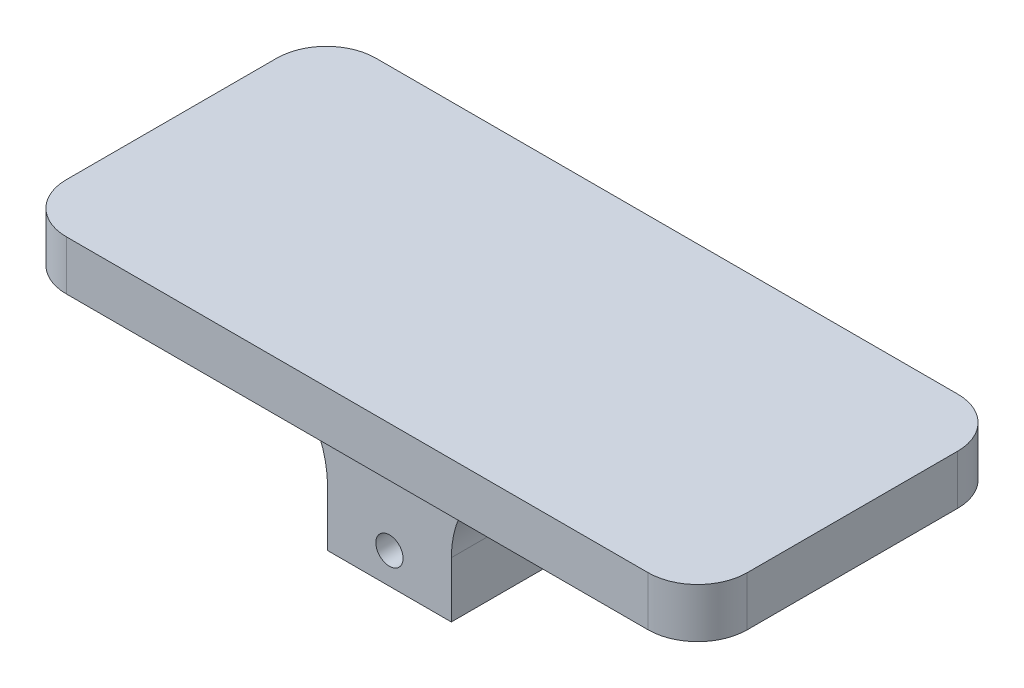
ISO-10303-21;
HEADER;
FILE_DESCRIPTION(('STEP AP214'),'2;1');
FILE_NAME('part.step','',(''),(''),'','','');
FILE_SCHEMA(('AUTOMOTIVE_DESIGN { 1 0 10303 214 1 1 1 1 }'));
ENDSEC;
DATA;
#1=APPLICATION_CONTEXT('core data for automotive mechanical design processes');
#2=APPLICATION_PROTOCOL_DEFINITION('international standard','automotive_design',2000,#1);
#3=PRODUCT_CONTEXT('',#1,'mechanical');
#4=PRODUCT('Part','Part','',(#3));
#5=PRODUCT_RELATED_PRODUCT_CATEGORY('part','',(#4));
#6=PRODUCT_DEFINITION_FORMATION('','',#4);
#7=PRODUCT_DEFINITION_CONTEXT('part definition',#1,'design');
#8=PRODUCT_DEFINITION('design','',#6,#7);
#9=PRODUCT_DEFINITION_SHAPE('','',#8);
#10=(LENGTH_UNIT() NAMED_UNIT(*) SI_UNIT(.MILLI.,.METRE.));
#11=(NAMED_UNIT(*) PLANE_ANGLE_UNIT() SI_UNIT($,.RADIAN.));
#12=(NAMED_UNIT(*) SI_UNIT($,.STERADIAN.) SOLID_ANGLE_UNIT());
#13=UNCERTAINTY_MEASURE_WITH_UNIT(LENGTH_MEASURE(1.E-05),#10,'distance_accuracy_value','');
#14=(GEOMETRIC_REPRESENTATION_CONTEXT(3) GLOBAL_UNCERTAINTY_ASSIGNED_CONTEXT((#13)) GLOBAL_UNIT_ASSIGNED_CONTEXT((#10,
#11,#12)) REPRESENTATION_CONTEXT('',''));
#15=CARTESIAN_POINT('',(0.,0.,0.));
#16=DIRECTION('',(0.,0.,1.));
#17=DIRECTION('',(1.,0.,0.));
#18=AXIS2_PLACEMENT_3D('',#15,#16,#17);
#19=CARTESIAN_POINT('',(0.,0.,0.));
#20=DIRECTION('',(0.,1.,0.));
#21=DIRECTION('',(0.,0.,1.));
#22=AXIS2_PLACEMENT_3D('',#19,#20,#21);
#23=PLANE('',#22);
#24=DIRECTION('',(-1.,0.,0.));
#25=VECTOR('',#24,1.);
#26=CARTESIAN_POINT('',(27.5,0.,-12.5));
#27=LINE('',#26,#25);
#28=CARTESIAN_POINT('',(23.5,0.,-12.5));
#29=VERTEX_POINT('',#28);
#30=CARTESIAN_POINT('',(-23.5,0.,-12.5));
#31=VERTEX_POINT('',#30);
#32=EDGE_CURVE('E193',#29,#31,#27,.T.);
#33=ORIENTED_EDGE('',*,*,#32,.F.);
#34=CARTESIAN_POINT('',(23.5,0.,-8.5));
#35=DIRECTION('',(0.,1.,0.));
#36=DIRECTION('',(0.,0.,1.));
#37=AXIS2_PLACEMENT_3D('',#34,#35,#36);
#38=CIRCLE('',#37,4.);
#39=CARTESIAN_POINT('',(27.5,0.,-8.5));
#40=VERTEX_POINT('',#39);
#41=EDGE_CURVE('E240',#29,#40,#38,.F.);
#42=ORIENTED_EDGE('',*,*,#41,.T.);
#43=DIRECTION('',(0.,0.,-1.));
#44=VECTOR('',#43,1.);
#45=CARTESIAN_POINT('',(27.5,0.,12.5));
#46=LINE('',#45,#44);
#47=CARTESIAN_POINT('',(27.5,0.,8.5));
#48=VERTEX_POINT('',#47);
#49=EDGE_CURVE('E206',#48,#40,#46,.T.);
#50=ORIENTED_EDGE('',*,*,#49,.F.);
#51=CARTESIAN_POINT('',(23.5,0.,8.5));
#52=DIRECTION('',(0.,1.,0.));
#53=DIRECTION('',(0.,0.,1.));
#54=AXIS2_PLACEMENT_3D('',#51,#52,#53);
#55=CIRCLE('',#54,4.);
#56=CARTESIAN_POINT('',(23.5,0.,12.5));
#57=VERTEX_POINT('',#56);
#58=EDGE_CURVE('E238',#48,#57,#55,.F.);
#59=ORIENTED_EDGE('',*,*,#58,.T.);
#60=DIRECTION('',(1.,0.,0.));
#61=VECTOR('',#60,1.);
#62=CARTESIAN_POINT('',(27.5,0.,12.5));
#63=LINE('',#62,#61);
#64=CARTESIAN_POINT('',(-23.5,0.,12.5));
#65=VERTEX_POINT('',#64);
#66=EDGE_CURVE('E204',#65,#57,#63,.T.);
#67=ORIENTED_EDGE('',*,*,#66,.F.);
#68=CARTESIAN_POINT('',(-23.5,0.,8.5));
#69=DIRECTION('',(0.,1.,0.));
#70=DIRECTION('',(0.,0.,1.));
#71=AXIS2_PLACEMENT_3D('',#68,#69,#70);
#72=CIRCLE('',#71,4.);
#73=CARTESIAN_POINT('',(-27.5,0.,8.5));
#74=VERTEX_POINT('',#73);
#75=EDGE_CURVE('E236',#65,#74,#72,.F.);
#76=ORIENTED_EDGE('',*,*,#75,.T.);
#77=DIRECTION('',(0.,0.,1.));
#78=VECTOR('',#77,1.);
#79=CARTESIAN_POINT('',(-27.5,0.,12.5));
#80=LINE('',#79,#78);
#81=CARTESIAN_POINT('',(-27.5,0.,-8.5));
#82=VERTEX_POINT('',#81);
#83=EDGE_CURVE('E187',#82,#74,#80,.T.);
#84=ORIENTED_EDGE('',*,*,#83,.F.);
#85=CARTESIAN_POINT('',(-23.5,0.,-8.5));
#86=DIRECTION('',(0.,1.,0.));
#87=DIRECTION('',(0.,0.,1.));
#88=AXIS2_PLACEMENT_3D('',#85,#86,#87);
#89=CIRCLE('',#88,4.);
#90=EDGE_CURVE('E234',#82,#31,#89,.F.);
#91=ORIENTED_EDGE('',*,*,#90,.T.);
#92=EDGE_LOOP('',(#33,#42,#50,#59,#67,#76,#84,#91));
#93=FACE_BOUND('',#92,.T.);
#94=CARTESIAN_POINT('',(-22.5,0.,0.));
#95=DIRECTION('',(0.,-1.,0.));
#96=DIRECTION('',(0.,0.,-1.));
#97=AXIS2_PLACEMENT_3D('',#94,#95,#96);
#98=CIRCLE('',#97,2.99999999999999);
#99=CARTESIAN_POINT('',(-22.5,0.,-2.99999999999999));
#100=VERTEX_POINT('',#99);
#101=EDGE_CURVE('E181',#100,#100,#98,.T.);
#102=ORIENTED_EDGE('',*,*,#101,.F.);
#103=EDGE_LOOP('',(#102));
#104=FACE_BOUND('',#103,.T.);
#105=DIRECTION('',(0.,0.,-1.));
#106=VECTOR('',#105,1.);
#107=CARTESIAN_POINT('',(10.5,0.,-7.4));
#108=LINE('',#107,#106);
#109=CARTESIAN_POINT('',(10.5,0.,7.4));
#110=VERTEX_POINT('',#109);
#111=CARTESIAN_POINT('',(10.5,0.,-7.4));
#112=VERTEX_POINT('',#111);
#113=EDGE_CURVE('E213',#110,#112,#108,.T.);
#114=ORIENTED_EDGE('',*,*,#113,.T.);
#115=DIRECTION('',(-1.,0.,0.));
#116=VECTOR('',#115,1.);
#117=CARTESIAN_POINT('',(2.50000000000001,0.,-7.4));
#118=LINE('',#117,#116);
#119=CARTESIAN_POINT('',(-15.5,0.,-7.4));
#120=VERTEX_POINT('',#119);
#121=EDGE_CURVE('E168',#112,#120,#118,.T.);
#122=ORIENTED_EDGE('',*,*,#121,.T.);
#123=DIRECTION('',(0.,0.,-1.));
#124=VECTOR('',#123,1.);
#125=CARTESIAN_POINT('',(-15.5,0.,7.4));
#126=LINE('',#125,#124);
#127=CARTESIAN_POINT('',(-15.5,0.,7.4));
#128=VERTEX_POINT('',#127);
#129=EDGE_CURVE('E201',#120,#128,#126,.F.);
#130=ORIENTED_EDGE('',*,*,#129,.T.);
#131=DIRECTION('',(-1.,0.,0.));
#132=VECTOR('',#131,1.);
#133=CARTESIAN_POINT('',(2.50000000000001,0.,7.4));
#134=LINE('',#133,#132);
#135=EDGE_CURVE('E148',#110,#128,#134,.T.);
#136=ORIENTED_EDGE('',*,*,#135,.F.);
#137=EDGE_LOOP('',(#114,#122,#130,#136));
#138=FACE_BOUND('',#137,.T.);
#139=ADVANCED_FACE('F34',(#93,#104,#138),#23,.F.);
#140=CARTESIAN_POINT('',(-27.5,4.,12.5));
#141=DIRECTION('',(1.,0.,0.));
#142=DIRECTION('',(0.,0.,-1.));
#143=AXIS2_PLACEMENT_3D('',#140,#141,#142);
#144=PLANE('',#143);
#145=ORIENTED_EDGE('',*,*,#83,.T.);
#146=DIRECTION('',(0.,-1.,0.));
#147=VECTOR('',#146,1.);
#148=CARTESIAN_POINT('',(-27.5,4.,8.5));
#149=LINE('',#148,#147);
#150=CARTESIAN_POINT('',(-27.5,4.,8.5));
#151=VERTEX_POINT('',#150);
#152=EDGE_CURVE('E11',#74,#151,#149,.F.);
#153=ORIENTED_EDGE('',*,*,#152,.T.);
#154=DIRECTION('',(0.,0.,1.));
#155=VECTOR('',#154,1.);
#156=CARTESIAN_POINT('',(-27.5,4.,12.5));
#157=LINE('',#156,#155);
#158=CARTESIAN_POINT('',(-27.5,4.,-8.5));
#159=VERTEX_POINT('',#158);
#160=EDGE_CURVE('E190',#159,#151,#157,.T.);
#161=ORIENTED_EDGE('',*,*,#160,.F.);
#162=DIRECTION('',(0.,-1.,0.));
#163=VECTOR('',#162,1.);
#164=CARTESIAN_POINT('',(-27.5,4.,-8.5));
#165=LINE('',#164,#163);
#166=EDGE_CURVE('E42',#159,#82,#165,.T.);
#167=ORIENTED_EDGE('',*,*,#166,.T.);
#168=EDGE_LOOP('',(#145,#153,#161,#167));
#169=FACE_BOUND('',#168,.T.);
#170=ADVANCED_FACE('F262',(#169),#144,.F.);
#171=CARTESIAN_POINT('',(27.5,4.,12.5));
#172=DIRECTION('',(0.,0.,-1.));
#173=DIRECTION('',(-1.,0.,0.));
#174=AXIS2_PLACEMENT_3D('',#171,#172,#173);
#175=PLANE('',#174);
#176=ORIENTED_EDGE('',*,*,#66,.T.);
#177=DIRECTION('',(0.,-1.,0.));
#178=VECTOR('',#177,1.);
#179=CARTESIAN_POINT('',(23.5,4.,12.5));
#180=LINE('',#179,#178);
#181=CARTESIAN_POINT('',(23.5,4.,12.5));
#182=VERTEX_POINT('',#181);
#183=EDGE_CURVE('E49',#57,#182,#180,.F.);
#184=ORIENTED_EDGE('',*,*,#183,.T.);
#185=DIRECTION('',(1.,0.,0.));
#186=VECTOR('',#185,1.);
#187=CARTESIAN_POINT('',(27.5,4.,12.5));
#188=LINE('',#187,#186);
#189=CARTESIAN_POINT('',(-23.5,4.,12.5));
#190=VERTEX_POINT('',#189);
#191=EDGE_CURVE('E192',#190,#182,#188,.T.);
#192=ORIENTED_EDGE('',*,*,#191,.F.);
#193=DIRECTION('',(0.,-1.,0.));
#194=VECTOR('',#193,1.);
#195=CARTESIAN_POINT('',(-23.5,4.,12.5));
#196=LINE('',#195,#194);
#197=EDGE_CURVE('E254',#190,#65,#196,.T.);
#198=ORIENTED_EDGE('',*,*,#197,.T.);
#199=EDGE_LOOP('',(#176,#184,#192,#198));
#200=FACE_BOUND('',#199,.T.);
#201=ADVANCED_FACE('F273',(#200),#175,.F.);
#202=CARTESIAN_POINT('',(27.5,4.,12.5));
#203=DIRECTION('',(-1.,0.,0.));
#204=DIRECTION('',(0.,0.,1.));
#205=AXIS2_PLACEMENT_3D('',#202,#203,#204);
#206=PLANE('',#205);
#207=ORIENTED_EDGE('',*,*,#49,.T.);
#208=DIRECTION('',(0.,-1.,0.));
#209=VECTOR('',#208,1.);
#210=CARTESIAN_POINT('',(27.5,4.,-8.5));
#211=LINE('',#210,#209);
#212=CARTESIAN_POINT('',(27.5,4.,-8.5));
#213=VERTEX_POINT('',#212);
#214=EDGE_CURVE('E245',#40,#213,#211,.F.);
#215=ORIENTED_EDGE('',*,*,#214,.T.);
#216=DIRECTION('',(0.,0.,-1.));
#217=VECTOR('',#216,1.);
#218=CARTESIAN_POINT('',(27.5,4.,12.5));
#219=LINE('',#218,#217);
#220=CARTESIAN_POINT('',(27.5,4.,8.5));
#221=VERTEX_POINT('',#220);
#222=EDGE_CURVE('E195',#221,#213,#219,.T.);
#223=ORIENTED_EDGE('',*,*,#222,.F.);
#224=DIRECTION('',(0.,-1.,0.));
#225=VECTOR('',#224,1.);
#226=CARTESIAN_POINT('',(27.5,4.,8.5));
#227=LINE('',#226,#225);
#228=EDGE_CURVE('E242',#221,#48,#227,.T.);
#229=ORIENTED_EDGE('',*,*,#228,.T.);
#230=EDGE_LOOP('',(#207,#215,#223,#229));
#231=FACE_BOUND('',#230,.T.);
#232=ADVANCED_FACE('F282',(#231),#206,.F.);
#233=CARTESIAN_POINT('',(27.5,4.,-12.5));
#234=DIRECTION('',(0.,0.,1.));
#235=DIRECTION('',(1.,0.,0.));
#236=AXIS2_PLACEMENT_3D('',#233,#234,#235);
#237=PLANE('',#236);
#238=DIRECTION('',(-1.,0.,0.));
#239=VECTOR('',#238,1.);
#240=CARTESIAN_POINT('',(27.5,4.,-12.5));
#241=LINE('',#240,#239);
#242=CARTESIAN_POINT('',(23.5,4.,-12.5));
#243=VERTEX_POINT('',#242);
#244=CARTESIAN_POINT('',(-23.5,4.,-12.5));
#245=VERTEX_POINT('',#244);
#246=EDGE_CURVE('E198',#243,#245,#241,.T.);
#247=ORIENTED_EDGE('',*,*,#246,.F.);
#248=DIRECTION('',(0.,-1.,0.));
#249=VECTOR('',#248,1.);
#250=CARTESIAN_POINT('',(23.5,4.,-12.5));
#251=LINE('',#250,#249);
#252=EDGE_CURVE('E231',#243,#29,#251,.T.);
#253=ORIENTED_EDGE('',*,*,#252,.T.);
#254=ORIENTED_EDGE('',*,*,#32,.T.);
#255=DIRECTION('',(0.,-1.,0.));
#256=VECTOR('',#255,1.);
#257=CARTESIAN_POINT('',(-23.5,4.,-12.5));
#258=LINE('',#257,#256);
#259=EDGE_CURVE('E229',#31,#245,#258,.F.);
#260=ORIENTED_EDGE('',*,*,#259,.T.);
#261=EDGE_LOOP('',(#247,#253,#254,#260));
#262=FACE_BOUND('',#261,.T.);
#263=ADVANCED_FACE('F290',(#262),#237,.F.);
#264=CARTESIAN_POINT('',(0.,4.,0.));
#265=DIRECTION('',(0.,1.,0.));
#266=DIRECTION('',(0.,0.,1.));
#267=AXIS2_PLACEMENT_3D('',#264,#265,#266);
#268=PLANE('',#267);
#269=ORIENTED_EDGE('',*,*,#222,.T.);
#270=CARTESIAN_POINT('',(23.5,4.,-8.5));
#271=DIRECTION('',(0.,1.,0.));
#272=DIRECTION('',(0.,0.,1.));
#273=AXIS2_PLACEMENT_3D('',#270,#271,#272);
#274=CIRCLE('',#273,4.);
#275=EDGE_CURVE('E252',#213,#243,#274,.T.);
#276=ORIENTED_EDGE('',*,*,#275,.T.);
#277=ORIENTED_EDGE('',*,*,#246,.T.);
#278=CARTESIAN_POINT('',(-23.5,4.,-8.5));
#279=DIRECTION('',(0.,1.,0.));
#280=DIRECTION('',(0.,0.,1.));
#281=AXIS2_PLACEMENT_3D('',#278,#279,#280);
#282=CIRCLE('',#281,4.);
#283=EDGE_CURVE('E247',#245,#159,#282,.T.);
#284=ORIENTED_EDGE('',*,*,#283,.T.);
#285=ORIENTED_EDGE('',*,*,#160,.T.);
#286=CARTESIAN_POINT('',(-23.5,4.,8.5));
#287=DIRECTION('',(0.,1.,0.));
#288=DIRECTION('',(0.,0.,1.));
#289=AXIS2_PLACEMENT_3D('',#286,#287,#288);
#290=CIRCLE('',#289,4.);
#291=EDGE_CURVE('E56',#151,#190,#290,.T.);
#292=ORIENTED_EDGE('',*,*,#291,.T.);
#293=ORIENTED_EDGE('',*,*,#191,.T.);
#294=CARTESIAN_POINT('',(23.5,4.,8.5));
#295=DIRECTION('',(0.,1.,0.));
#296=DIRECTION('',(0.,0.,1.));
#297=AXIS2_PLACEMENT_3D('',#294,#295,#296);
#298=CIRCLE('',#297,4.);
#299=EDGE_CURVE('E250',#182,#221,#298,.T.);
#300=ORIENTED_EDGE('',*,*,#299,.T.);
#301=EDGE_LOOP('',(#269,#276,#277,#284,#285,#292,#293,#300));
#302=FACE_BOUND('',#301,.T.);
#303=ADVANCED_FACE('F275',(#302),#268,.T.);
#304=CARTESIAN_POINT('',(-22.5,2.5,0.));
#305=DIRECTION('',(0.,-1.,0.));
#306=DIRECTION('',(0.,0.,-1.));
#307=AXIS2_PLACEMENT_3D('',#304,#305,#306);
#308=CYLINDRICAL_SURFACE('',#307,2.99999999999999);
#309=CARTESIAN_POINT('',(-22.5,2.5,0.));
#310=DIRECTION('',(0.,-1.,0.));
#311=DIRECTION('',(0.,0.,-1.));
#312=AXIS2_PLACEMENT_3D('',#309,#310,#311);
#313=CIRCLE('',#312,2.99999999999999);
#314=CARTESIAN_POINT('',(-22.5,2.5,-2.99999999999999));
#315=VERTEX_POINT('',#314);
#316=EDGE_CURVE('E184',#315,#315,#313,.T.);
#317=ORIENTED_EDGE('',*,*,#316,.F.);
#318=EDGE_LOOP('',(#317));
#319=FACE_BOUND('',#318,.T.);
#320=ORIENTED_EDGE('',*,*,#101,.T.);
#321=EDGE_LOOP('',(#320));
#322=FACE_BOUND('',#321,.T.);
#323=ADVANCED_FACE('F433',(#319,#322),#308,.F.);
#324=CARTESIAN_POINT('',(-22.5,2.5,0.));
#325=DIRECTION('',(0.,-1.,0.));
#326=DIRECTION('',(0.,0.,-1.));
#327=AXIS2_PLACEMENT_3D('',#324,#325,#326);
#328=PLANE('',#327);
#329=CARTESIAN_POINT('',(-22.5,2.5,0.));
#330=DIRECTION('',(0.,-1.,0.));
#331=DIRECTION('',(0.,0.,-1.));
#332=AXIS2_PLACEMENT_3D('',#329,#330,#331);
#333=CIRCLE('',#332,2.);
#334=CARTESIAN_POINT('',(-22.5,2.5,-2.));
#335=VERTEX_POINT('',#334);
#336=EDGE_CURVE('E157',#335,#335,#333,.T.);
#337=ORIENTED_EDGE('',*,*,#336,.F.);
#338=EDGE_LOOP('',(#337));
#339=FACE_BOUND('',#338,.T.);
#340=ORIENTED_EDGE('',*,*,#316,.T.);
#341=EDGE_LOOP('',(#340));
#342=FACE_BOUND('',#341,.T.);
#343=ADVANCED_FACE('F424',(#339,#342),#328,.T.);
#344=CARTESIAN_POINT('',(-22.5,-1.,0.));
#345=DIRECTION('',(0.,1.,0.));
#346=DIRECTION('',(0.,0.,1.));
#347=AXIS2_PLACEMENT_3D('',#344,#345,#346);
#348=CYLINDRICAL_SURFACE('',#347,2.);
#349=CARTESIAN_POINT('',(-22.5,-1.,0.));
#350=DIRECTION('',(0.,-1.,0.));
#351=DIRECTION('',(0.,0.,-1.));
#352=AXIS2_PLACEMENT_3D('',#349,#350,#351);
#353=CIRCLE('',#352,2.);
#354=CARTESIAN_POINT('',(-22.5,-1.,-2.));
#355=VERTEX_POINT('',#354);
#356=EDGE_CURVE('E178',#355,#355,#353,.T.);
#357=ORIENTED_EDGE('',*,*,#356,.F.);
#358=EDGE_LOOP('',(#357));
#359=FACE_BOUND('',#358,.T.);
#360=ORIENTED_EDGE('',*,*,#336,.T.);
#361=EDGE_LOOP('',(#360));
#362=FACE_BOUND('',#361,.T.);
#363=ADVANCED_FACE('F415',(#359,#362),#348,.T.);
#364=CARTESIAN_POINT('',(-22.5,-1.,0.));
#365=DIRECTION('',(0.,-1.,0.));
#366=DIRECTION('',(0.,0.,-1.));
#367=AXIS2_PLACEMENT_3D('',#364,#365,#366);
#368=PLANE('',#367);
#369=ORIENTED_EDGE('',*,*,#356,.T.);
#370=EDGE_LOOP('',(#369));
#371=FACE_BOUND('',#370,.T.);
#372=ADVANCED_FACE('F403',(#371),#368,.T.);
#373=CARTESIAN_POINT('',(0.,0.,7.4));
#374=DIRECTION('',(0.,0.,1.));
#375=DIRECTION('',(1.,0.,0.));
#376=AXIS2_PLACEMENT_3D('',#373,#374,#375);
#377=PLANE('',#376);
#378=ORIENTED_EDGE('',*,*,#135,.T.);
#379=CARTESIAN_POINT('',(-15.5,-8.,7.4));
#380=DIRECTION('',(0.,0.,1.));
#381=DIRECTION('',(1.,0.,0.));
#382=AXIS2_PLACEMENT_3D('',#379,#380,#381);
#383=CIRCLE('',#382,8.);
#384=CARTESIAN_POINT('',(-7.49999999999999,-8.,7.4));
#385=VERTEX_POINT('',#384);
#386=EDGE_CURVE('E144',#128,#385,#383,.F.);
#387=ORIENTED_EDGE('',*,*,#386,.T.);
#388=DIRECTION('',(0.,-1.,0.));
#389=VECTOR('',#388,1.);
#390=CARTESIAN_POINT('',(-7.49999999999999,0.,7.4));
#391=LINE('',#390,#389);
#392=CARTESIAN_POINT('',(-7.49999999999999,-12.5,7.4));
#393=VERTEX_POINT('',#392);
#394=EDGE_CURVE('E135',#385,#393,#391,.T.);
#395=ORIENTED_EDGE('',*,*,#394,.T.);
#396=DIRECTION('',(1.,0.,0.));
#397=VECTOR('',#396,1.);
#398=CARTESIAN_POINT('',(-7.49999999999999,-12.5,7.4));
#399=LINE('',#398,#397);
#400=CARTESIAN_POINT('',(2.50000000000001,-12.5,7.4));
#401=VERTEX_POINT('',#400);
#402=EDGE_CURVE('E141',#393,#401,#399,.T.);
#403=ORIENTED_EDGE('',*,*,#402,.T.);
#404=DIRECTION('',(0.,1.,0.));
#405=VECTOR('',#404,1.);
#406=CARTESIAN_POINT('',(2.50000000000001,0.,7.4));
#407=LINE('',#406,#405);
#408=CARTESIAN_POINT('',(2.50000000000001,-8.,7.4));
#409=VERTEX_POINT('',#408);
#410=EDGE_CURVE('E163',#401,#409,#407,.T.);
#411=ORIENTED_EDGE('',*,*,#410,.T.);
#412=CARTESIAN_POINT('',(10.5,-8.,7.4));
#413=DIRECTION('',(0.,0.,1.));
#414=DIRECTION('',(1.,0.,0.));
#415=AXIS2_PLACEMENT_3D('',#412,#413,#414);
#416=CIRCLE('',#415,8.);
#417=EDGE_CURVE('E222',#409,#110,#416,.F.);
#418=ORIENTED_EDGE('',*,*,#417,.T.);
#419=EDGE_LOOP('',(#378,#387,#395,#403,#411,#418));
#420=FACE_BOUND('',#419,.T.);
#421=CARTESIAN_POINT('',(-2.49999999999999,-10.,7.4));
#422=DIRECTION('',(0.,0.,1.));
#423=DIRECTION('',(1.,0.,0.));
#424=AXIS2_PLACEMENT_3D('',#421,#422,#423);
#425=CIRCLE('',#424,1.1);
#426=CARTESIAN_POINT('',(-1.39999999999999,-10.,7.4));
#427=VERTEX_POINT('',#426);
#428=EDGE_CURVE('E170',#427,#427,#425,.T.);
#429=ORIENTED_EDGE('',*,*,#428,.F.);
#430=EDGE_LOOP('',(#429));
#431=FACE_BOUND('',#430,.T.);
#432=ADVANCED_FACE('F137',(#420,#431),#377,.T.);
#433=CARTESIAN_POINT('',(0.,0.,-7.4));
#434=DIRECTION('',(0.,0.,1.));
#435=DIRECTION('',(1.,0.,0.));
#436=AXIS2_PLACEMENT_3D('',#433,#434,#435);
#437=PLANE('',#436);
#438=ORIENTED_EDGE('',*,*,#121,.F.);
#439=CARTESIAN_POINT('',(10.5,-8.,-7.4));
#440=DIRECTION('',(0.,0.,1.));
#441=DIRECTION('',(1.,0.,0.));
#442=AXIS2_PLACEMENT_3D('',#439,#440,#441);
#443=CIRCLE('',#442,8.);
#444=CARTESIAN_POINT('',(2.50000000000001,-8.,-7.4));
#445=VERTEX_POINT('',#444);
#446=EDGE_CURVE('E220',#112,#445,#443,.T.);
#447=ORIENTED_EDGE('',*,*,#446,.T.);
#448=DIRECTION('',(0.,1.,0.));
#449=VECTOR('',#448,1.);
#450=CARTESIAN_POINT('',(2.50000000000001,0.,-7.4));
#451=LINE('',#450,#449);
#452=CARTESIAN_POINT('',(2.50000000000001,-12.5,-7.4));
#453=VERTEX_POINT('',#452);
#454=EDGE_CURVE('E174',#453,#445,#451,.T.);
#455=ORIENTED_EDGE('',*,*,#454,.F.);
#456=DIRECTION('',(1.,0.,0.));
#457=VECTOR('',#456,1.);
#458=CARTESIAN_POINT('',(-7.49999999999999,-12.5,-7.4));
#459=LINE('',#458,#457);
#460=CARTESIAN_POINT('',(-7.49999999999999,-12.5,-7.4));
#461=VERTEX_POINT('',#460);
#462=EDGE_CURVE('E172',#461,#453,#459,.T.);
#463=ORIENTED_EDGE('',*,*,#462,.F.);
#464=DIRECTION('',(0.,-1.,0.));
#465=VECTOR('',#464,1.);
#466=CARTESIAN_POINT('',(-7.49999999999999,0.,-7.4));
#467=LINE('',#466,#465);
#468=CARTESIAN_POINT('',(-7.49999999999999,-8.,-7.4));
#469=VERTEX_POINT('',#468);
#470=EDGE_CURVE('E154',#469,#461,#467,.T.);
#471=ORIENTED_EDGE('',*,*,#470,.F.);
#472=CARTESIAN_POINT('',(-15.5,-8.,-7.4));
#473=DIRECTION('',(0.,0.,1.));
#474=DIRECTION('',(1.,0.,0.));
#475=AXIS2_PLACEMENT_3D('',#472,#473,#474);
#476=CIRCLE('',#475,8.);
#477=EDGE_CURVE('E225',#469,#120,#476,.T.);
#478=ORIENTED_EDGE('',*,*,#477,.T.);
#479=EDGE_LOOP('',(#438,#447,#455,#463,#471,#478));
#480=FACE_BOUND('',#479,.T.);
#481=CARTESIAN_POINT('',(-2.49999999999999,-10.,-7.4));
#482=DIRECTION('',(0.,0.,1.));
#483=DIRECTION('',(1.,0.,0.));
#484=AXIS2_PLACEMENT_3D('',#481,#482,#483);
#485=CIRCLE('',#484,1.1);
#486=CARTESIAN_POINT('',(-1.39999999999999,-10.,-7.4));
#487=VERTEX_POINT('',#486);
#488=EDGE_CURVE('E496',#487,#487,#485,.T.);
#489=ORIENTED_EDGE('',*,*,#488,.T.);
#490=EDGE_LOOP('',(#489));
#491=FACE_BOUND('',#490,.T.);
#492=ADVANCED_FACE('F388',(#480,#491),#437,.F.);
#493=CARTESIAN_POINT('',(-7.49999999999999,0.,7.4));
#494=DIRECTION('',(1.,0.,0.));
#495=DIRECTION('',(0.,1.,0.));
#496=AXIS2_PLACEMENT_3D('',#493,#494,#495);
#497=PLANE('',#496);
#498=ORIENTED_EDGE('',*,*,#394,.F.);
#499=DIRECTION('',(0.,0.,-1.));
#500=VECTOR('',#499,1.);
#501=CARTESIAN_POINT('',(-7.49999999999999,-8.,-7.4));
#502=LINE('',#501,#500);
#503=EDGE_CURVE('E218',#385,#469,#502,.T.);
#504=ORIENTED_EDGE('',*,*,#503,.T.);
#505=ORIENTED_EDGE('',*,*,#470,.T.);
#506=DIRECTION('',(0.,0.,-1.));
#507=VECTOR('',#506,1.);
#508=CARTESIAN_POINT('',(-7.49999999999999,-12.5,7.4));
#509=LINE('',#508,#507);
#510=EDGE_CURVE('E151',#393,#461,#509,.T.);
#511=ORIENTED_EDGE('',*,*,#510,.F.);
#512=EDGE_LOOP('',(#498,#504,#505,#511));
#513=FACE_BOUND('',#512,.T.);
#514=ADVANCED_FACE('F152',(#513),#497,.F.);
#515=CARTESIAN_POINT('',(-7.49999999999999,-12.5,7.4));
#516=DIRECTION('',(0.,1.,0.));
#517=DIRECTION('',(0.,0.,1.));
#518=AXIS2_PLACEMENT_3D('',#515,#516,#517);
#519=PLANE('',#518);
#520=ORIENTED_EDGE('',*,*,#462,.T.);
#521=DIRECTION('',(0.,0.,-1.));
#522=VECTOR('',#521,1.);
#523=CARTESIAN_POINT('',(2.50000000000001,-12.5,7.4));
#524=LINE('',#523,#522);
#525=EDGE_CURVE('E158',#401,#453,#524,.T.);
#526=ORIENTED_EDGE('',*,*,#525,.F.);
#527=ORIENTED_EDGE('',*,*,#402,.F.);
#528=ORIENTED_EDGE('',*,*,#510,.T.);
#529=EDGE_LOOP('',(#520,#526,#527,#528));
#530=FACE_BOUND('',#529,.T.);
#531=ADVANCED_FACE('F160',(#530),#519,.F.);
#532=CARTESIAN_POINT('',(2.50000000000001,0.,7.4));
#533=DIRECTION('',(-1.,0.,0.));
#534=DIRECTION('',(0.,-1.,0.));
#535=AXIS2_PLACEMENT_3D('',#532,#533,#534);
#536=PLANE('',#535);
#537=ORIENTED_EDGE('',*,*,#454,.T.);
#538=DIRECTION('',(0.,0.,-1.));
#539=VECTOR('',#538,1.);
#540=CARTESIAN_POINT('',(2.50000000000001,-8.,7.4));
#541=LINE('',#540,#539);
#542=EDGE_CURVE('E216',#445,#409,#541,.F.);
#543=ORIENTED_EDGE('',*,*,#542,.T.);
#544=ORIENTED_EDGE('',*,*,#410,.F.);
#545=ORIENTED_EDGE('',*,*,#525,.T.);
#546=EDGE_LOOP('',(#537,#543,#544,#545));
#547=FACE_BOUND('',#546,.T.);
#548=ADVANCED_FACE('F363',(#547),#536,.F.);
#549=CARTESIAN_POINT('',(-2.49999999999999,-10.,7.4));
#550=DIRECTION('',(0.,0.,-1.));
#551=DIRECTION('',(-1.,0.,0.));
#552=AXIS2_PLACEMENT_3D('',#549,#550,#551);
#553=CYLINDRICAL_SURFACE('',#552,1.1);
#554=ORIENTED_EDGE('',*,*,#428,.T.);
#555=EDGE_LOOP('',(#554));
#556=FACE_BOUND('',#555,.T.);
#557=ORIENTED_EDGE('',*,*,#488,.F.);
#558=EDGE_LOOP('',(#557));
#559=FACE_BOUND('',#558,.T.);
#560=ADVANCED_FACE('F315',(#556,#559),#553,.F.);
#561=CARTESIAN_POINT('',(10.5,-8.,0.));
#562=DIRECTION('',(0.,0.,1.));
#563=DIRECTION('',(1.,0.,0.));
#564=AXIS2_PLACEMENT_3D('',#561,#562,#563);
#565=CYLINDRICAL_SURFACE('',#564,8.);
#566=ORIENTED_EDGE('',*,*,#417,.F.);
#567=ORIENTED_EDGE('',*,*,#542,.F.);
#568=ORIENTED_EDGE('',*,*,#446,.F.);
#569=ORIENTED_EDGE('',*,*,#113,.F.);
#570=EDGE_LOOP('',(#566,#567,#568,#569));
#571=FACE_BOUND('',#570,.T.);
#572=ADVANCED_FACE('F311',(#571),#565,.F.);
#573=CARTESIAN_POINT('',(-15.5,-8.,7.4));
#574=DIRECTION('',(0.,0.,1.));
#575=DIRECTION('',(1.,0.,0.));
#576=AXIS2_PLACEMENT_3D('',#573,#574,#575);
#577=CYLINDRICAL_SURFACE('',#576,8.);
#578=ORIENTED_EDGE('',*,*,#386,.F.);
#579=ORIENTED_EDGE('',*,*,#129,.F.);
#580=ORIENTED_EDGE('',*,*,#477,.F.);
#581=ORIENTED_EDGE('',*,*,#503,.F.);
#582=EDGE_LOOP('',(#578,#579,#580,#581));
#583=FACE_BOUND('',#582,.T.);
#584=ADVANCED_FACE('F314',(#583),#577,.F.);
#585=CARTESIAN_POINT('',(23.5,4.,-8.5));
#586=DIRECTION('',(0.,-1.,0.));
#587=DIRECTION('',(0.,0.,-1.));
#588=AXIS2_PLACEMENT_3D('',#585,#586,#587);
#589=CYLINDRICAL_SURFACE('',#588,4.);
#590=ORIENTED_EDGE('',*,*,#275,.F.);
#591=ORIENTED_EDGE('',*,*,#214,.F.);
#592=ORIENTED_EDGE('',*,*,#41,.F.);
#593=ORIENTED_EDGE('',*,*,#252,.F.);
#594=EDGE_LOOP('',(#590,#591,#592,#593));
#595=FACE_BOUND('',#594,.T.);
#596=ADVANCED_FACE('F287',(#595),#589,.T.);
#597=CARTESIAN_POINT('',(23.5,4.,8.5));
#598=DIRECTION('',(0.,-1.,0.));
#599=DIRECTION('',(0.,0.,-1.));
#600=AXIS2_PLACEMENT_3D('',#597,#598,#599);
#601=CYLINDRICAL_SURFACE('',#600,4.);
#602=ORIENTED_EDGE('',*,*,#299,.F.);
#603=ORIENTED_EDGE('',*,*,#183,.F.);
#604=ORIENTED_EDGE('',*,*,#58,.F.);
#605=ORIENTED_EDGE('',*,*,#228,.F.);
#606=EDGE_LOOP('',(#602,#603,#604,#605));
#607=FACE_BOUND('',#606,.T.);
#608=ADVANCED_FACE('F279',(#607),#601,.T.);
#609=CARTESIAN_POINT('',(-23.5,4.,8.5));
#610=DIRECTION('',(0.,-1.,0.));
#611=DIRECTION('',(0.,0.,-1.));
#612=AXIS2_PLACEMENT_3D('',#609,#610,#611);
#613=CYLINDRICAL_SURFACE('',#612,4.);
#614=ORIENTED_EDGE('',*,*,#291,.F.);
#615=ORIENTED_EDGE('',*,*,#152,.F.);
#616=ORIENTED_EDGE('',*,*,#75,.F.);
#617=ORIENTED_EDGE('',*,*,#197,.F.);
#618=EDGE_LOOP('',(#614,#615,#616,#617));
#619=FACE_BOUND('',#618,.T.);
#620=ADVANCED_FACE('F272',(#619),#613,.T.);
#621=CARTESIAN_POINT('',(-23.5,4.,-8.5));
#622=DIRECTION('',(0.,-1.,0.));
#623=DIRECTION('',(0.,0.,-1.));
#624=AXIS2_PLACEMENT_3D('',#621,#622,#623);
#625=CYLINDRICAL_SURFACE('',#624,4.);
#626=ORIENTED_EDGE('',*,*,#283,.F.);
#627=ORIENTED_EDGE('',*,*,#259,.F.);
#628=ORIENTED_EDGE('',*,*,#90,.F.);
#629=ORIENTED_EDGE('',*,*,#166,.F.);
#630=EDGE_LOOP('',(#626,#627,#628,#629));
#631=FACE_BOUND('',#630,.T.);
#632=ADVANCED_FACE('F36',(#631),#625,.T.);
#633=CLOSED_SHELL('',(#139,#170,#201,#232,#263,#303,#323,#343,#363,#372,#432,#492,#514,#531,
#548,#560,#572,#584,#596,#608,#620,#632));
#634=MANIFOLD_SOLID_BREP('B2',#633);
#635=ADVANCED_BREP_SHAPE_REPRESENTATION('',(#18,#634),#14);
#636=SHAPE_DEFINITION_REPRESENTATION(#9,#635);
ENDSEC;
END-ISO-10303-21;
